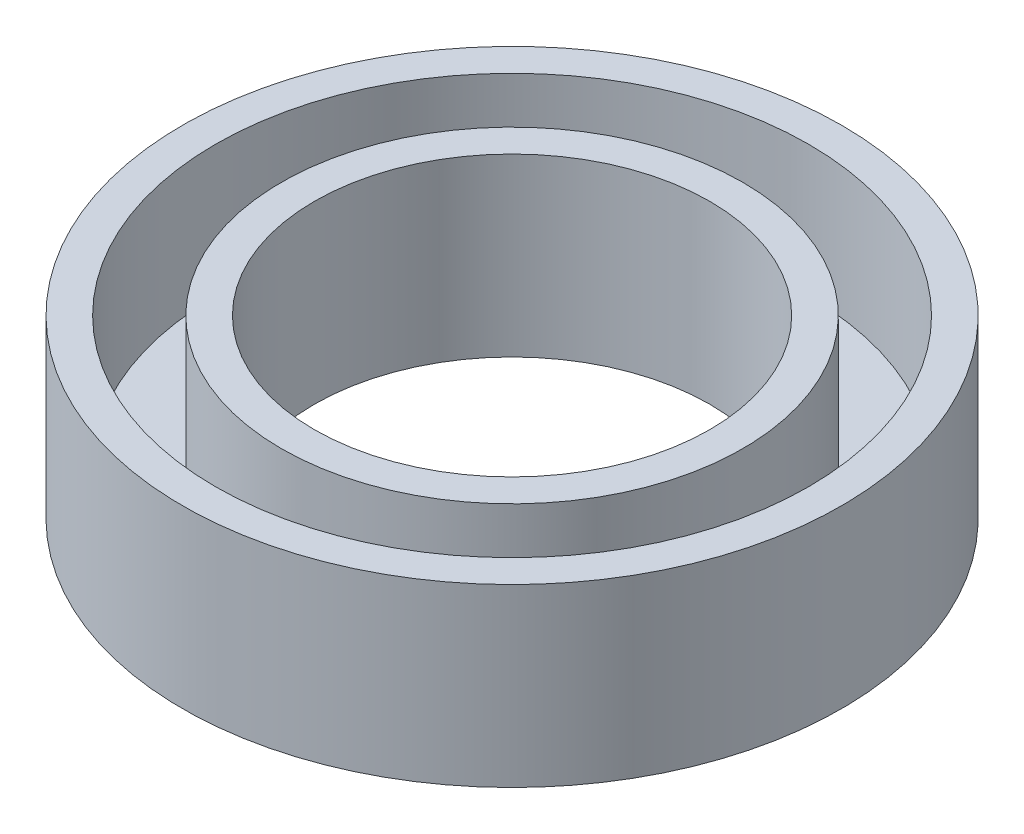
ISO-10303-21;
HEADER;
FILE_DESCRIPTION(('STEP AP214'),'2;1');
FILE_NAME('part.step','',(''),(''),'','','');
FILE_SCHEMA(('AUTOMOTIVE_DESIGN { 1 0 10303 214 1 1 1 1 }'));
ENDSEC;
DATA;
#1=APPLICATION_CONTEXT('core data for automotive mechanical design processes');
#2=APPLICATION_PROTOCOL_DEFINITION('international standard','automotive_design',2000,#1);
#3=PRODUCT_CONTEXT('',#1,'mechanical');
#4=PRODUCT('Part','Part','',(#3));
#5=PRODUCT_RELATED_PRODUCT_CATEGORY('part','',(#4));
#6=PRODUCT_DEFINITION_FORMATION('','',#4);
#7=PRODUCT_DEFINITION_CONTEXT('part definition',#1,'design');
#8=PRODUCT_DEFINITION('design','',#6,#7);
#9=PRODUCT_DEFINITION_SHAPE('','',#8);
#10=(LENGTH_UNIT() NAMED_UNIT(*) SI_UNIT(.MILLI.,.METRE.));
#11=(NAMED_UNIT(*) PLANE_ANGLE_UNIT() SI_UNIT($,.RADIAN.));
#12=(NAMED_UNIT(*) SI_UNIT($,.STERADIAN.) SOLID_ANGLE_UNIT());
#13=UNCERTAINTY_MEASURE_WITH_UNIT(LENGTH_MEASURE(1.E-05),#10,'distance_accuracy_value','');
#14=(GEOMETRIC_REPRESENTATION_CONTEXT(3) GLOBAL_UNCERTAINTY_ASSIGNED_CONTEXT((#13)) GLOBAL_UNIT_ASSIGNED_CONTEXT((#10,
#11,#12)) REPRESENTATION_CONTEXT('',''));
#15=CARTESIAN_POINT('',(0.,0.,0.));
#16=DIRECTION('',(0.,0.,1.));
#17=DIRECTION('',(1.,0.,0.));
#18=AXIS2_PLACEMENT_3D('',#15,#16,#17);
#19=CARTESIAN_POINT('',(0.,0.,0.));
#20=DIRECTION('',(0.,1.,0.));
#21=DIRECTION('',(0.,0.,1.));
#22=AXIS2_PLACEMENT_3D('',#19,#20,#21);
#23=PLANE('',#22);
#24=CARTESIAN_POINT('',(0.,0.,0.));
#25=DIRECTION('',(0.,-1.,0.));
#26=DIRECTION('',(0.,0.,-1.));
#27=AXIS2_PLACEMENT_3D('',#24,#25,#26);
#28=CIRCLE('',#27,9.);
#29=CARTESIAN_POINT('',(0.,0.,-9.));
#30=VERTEX_POINT('',#29);
#31=EDGE_CURVE('E10',#30,#30,#28,.T.);
#32=ORIENTED_EDGE('',*,*,#31,.F.);
#33=EDGE_LOOP('',(#32));
#34=FACE_BOUND('',#33,.T.);
#35=CARTESIAN_POINT('',(0.,0.,0.));
#36=DIRECTION('',(0.,-1.,0.));
#37=DIRECTION('',(0.,0.,-1.));
#38=AXIS2_PLACEMENT_3D('',#35,#36,#37);
#39=CIRCLE('',#38,15.);
#40=CARTESIAN_POINT('',(0.,0.,-15.));
#41=VERTEX_POINT('',#40);
#42=EDGE_CURVE('E76',#41,#41,#39,.T.);
#43=ORIENTED_EDGE('',*,*,#42,.T.);
#44=EDGE_LOOP('',(#43));
#45=FACE_BOUND('',#44,.T.);
#46=ADVANCED_FACE('F41',(#34,#45),#23,.F.);
#47=CARTESIAN_POINT('',(0.,0.,0.));
#48=DIRECTION('',(0.,-1.,0.));
#49=DIRECTION('',(0.,0.,-1.));
#50=AXIS2_PLACEMENT_3D('',#47,#48,#49);
#51=CYLINDRICAL_SURFACE('',#50,9.);
#52=CARTESIAN_POINT('',(0.,8.,0.));
#53=DIRECTION('',(0.,-1.,0.));
#54=DIRECTION('',(0.,0.,-1.));
#55=AXIS2_PLACEMENT_3D('',#52,#53,#54);
#56=CIRCLE('',#55,9.);
#57=CARTESIAN_POINT('',(0.,8.,-9.));
#58=VERTEX_POINT('',#57);
#59=EDGE_CURVE('E48',#58,#58,#56,.T.);
#60=ORIENTED_EDGE('',*,*,#59,.F.);
#61=EDGE_LOOP('',(#60));
#62=FACE_BOUND('',#61,.T.);
#63=ORIENTED_EDGE('',*,*,#31,.T.);
#64=EDGE_LOOP('',(#63));
#65=FACE_BOUND('',#64,.T.);
#66=ADVANCED_FACE('F95',(#62,#65),#51,.F.);
#67=CARTESIAN_POINT('',(0.,8.,0.));
#68=DIRECTION('',(0.,1.,0.));
#69=DIRECTION('',(0.,0.,1.));
#70=AXIS2_PLACEMENT_3D('',#67,#68,#69);
#71=PLANE('',#70);
#72=ORIENTED_EDGE('',*,*,#59,.T.);
#73=EDGE_LOOP('',(#72));
#74=FACE_BOUND('',#73,.T.);
#75=CARTESIAN_POINT('',(0.,8.,0.));
#76=DIRECTION('',(0.,-1.,0.));
#77=DIRECTION('',(0.,0.,-1.));
#78=AXIS2_PLACEMENT_3D('',#75,#76,#77);
#79=CIRCLE('',#78,10.5);
#80=CARTESIAN_POINT('',(0.,8.,-10.5));
#81=VERTEX_POINT('',#80);
#82=EDGE_CURVE('E53',#81,#81,#79,.T.);
#83=ORIENTED_EDGE('',*,*,#82,.F.);
#84=EDGE_LOOP('',(#83));
#85=FACE_BOUND('',#84,.T.);
#86=ADVANCED_FACE('F93',(#74,#85),#71,.T.);
#87=CARTESIAN_POINT('',(0.,0.,0.));
#88=DIRECTION('',(0.,-1.,0.));
#89=DIRECTION('',(0.,0.,-1.));
#90=AXIS2_PLACEMENT_3D('',#87,#88,#89);
#91=CYLINDRICAL_SURFACE('',#90,10.5);
#92=CARTESIAN_POINT('',(0.,2.,0.));
#93=DIRECTION('',(0.,-1.,0.));
#94=DIRECTION('',(0.,0.,-1.));
#95=AXIS2_PLACEMENT_3D('',#92,#93,#94);
#96=CIRCLE('',#95,10.5);
#97=CARTESIAN_POINT('',(0.,2.,-10.5));
#98=VERTEX_POINT('',#97);
#99=EDGE_CURVE('E58',#98,#98,#96,.T.);
#100=ORIENTED_EDGE('',*,*,#99,.F.);
#101=EDGE_LOOP('',(#100));
#102=FACE_BOUND('',#101,.T.);
#103=ORIENTED_EDGE('',*,*,#82,.T.);
#104=EDGE_LOOP('',(#103));
#105=FACE_BOUND('',#104,.T.);
#106=ADVANCED_FACE('F104',(#102,#105),#91,.T.);
#107=CARTESIAN_POINT('',(0.,2.,0.));
#108=DIRECTION('',(0.,1.,0.));
#109=DIRECTION('',(0.,0.,1.));
#110=AXIS2_PLACEMENT_3D('',#107,#108,#109);
#111=PLANE('',#110);
#112=ORIENTED_EDGE('',*,*,#99,.T.);
#113=EDGE_LOOP('',(#112));
#114=FACE_BOUND('',#113,.T.);
#115=CARTESIAN_POINT('',(0.,2.,0.));
#116=DIRECTION('',(0.,-1.,0.));
#117=DIRECTION('',(0.,0.,-1.));
#118=AXIS2_PLACEMENT_3D('',#115,#116,#117);
#119=CIRCLE('',#118,13.5);
#120=CARTESIAN_POINT('',(0.,2.,-13.5));
#121=VERTEX_POINT('',#120);
#122=EDGE_CURVE('E64',#121,#121,#119,.T.);
#123=ORIENTED_EDGE('',*,*,#122,.F.);
#124=EDGE_LOOP('',(#123));
#125=FACE_BOUND('',#124,.T.);
#126=ADVANCED_FACE('F108',(#114,#125),#111,.T.);
#127=CARTESIAN_POINT('',(0.,0.,0.));
#128=DIRECTION('',(0.,-1.,0.));
#129=DIRECTION('',(0.,0.,-1.));
#130=AXIS2_PLACEMENT_3D('',#127,#128,#129);
#131=CYLINDRICAL_SURFACE('',#130,13.5);
#132=ORIENTED_EDGE('',*,*,#122,.T.);
#133=EDGE_LOOP('',(#132));
#134=FACE_BOUND('',#133,.T.);
#135=CARTESIAN_POINT('',(0.,8.,0.));
#136=DIRECTION('',(0.,-1.,0.));
#137=DIRECTION('',(0.,0.,-1.));
#138=AXIS2_PLACEMENT_3D('',#135,#136,#137);
#139=CIRCLE('',#138,13.5);
#140=CARTESIAN_POINT('',(0.,8.,-13.5));
#141=VERTEX_POINT('',#140);
#142=EDGE_CURVE('E68',#141,#141,#139,.T.);
#143=ORIENTED_EDGE('',*,*,#142,.F.);
#144=EDGE_LOOP('',(#143));
#145=FACE_BOUND('',#144,.T.);
#146=ADVANCED_FACE('F90',(#134,#145),#131,.F.);
#147=ORIENTED_EDGE('',*,*,#142,.T.);
#148=EDGE_LOOP('',(#147));
#149=FACE_BOUND('',#148,.T.);
#150=CARTESIAN_POINT('',(0.,8.,0.));
#151=DIRECTION('',(0.,-1.,0.));
#152=DIRECTION('',(0.,0.,-1.));
#153=AXIS2_PLACEMENT_3D('',#150,#151,#152);
#154=CIRCLE('',#153,15.);
#155=CARTESIAN_POINT('',(0.,8.,-15.));
#156=VERTEX_POINT('',#155);
#157=EDGE_CURVE('E72',#156,#156,#154,.T.);
#158=ORIENTED_EDGE('',*,*,#157,.F.);
#159=EDGE_LOOP('',(#158));
#160=FACE_BOUND('',#159,.T.);
#161=ADVANCED_FACE('F84',(#149,#160),#71,.T.);
#162=CARTESIAN_POINT('',(0.,0.,0.));
#163=DIRECTION('',(0.,-1.,0.));
#164=DIRECTION('',(0.,0.,-1.));
#165=AXIS2_PLACEMENT_3D('',#162,#163,#164);
#166=CYLINDRICAL_SURFACE('',#165,15.);
#167=ORIENTED_EDGE('',*,*,#157,.T.);
#168=EDGE_LOOP('',(#167));
#169=FACE_BOUND('',#168,.T.);
#170=ORIENTED_EDGE('',*,*,#42,.F.);
#171=EDGE_LOOP('',(#170));
#172=FACE_BOUND('',#171,.T.);
#173=ADVANCED_FACE('F82',(#169,#172),#166,.T.);
#174=CLOSED_SHELL('',(#46,#66,#86,#106,#126,#146,#161,#173));
#175=MANIFOLD_SOLID_BREP('B2',#174);
#176=ADVANCED_BREP_SHAPE_REPRESENTATION('',(#18,#175),#14);
#177=SHAPE_DEFINITION_REPRESENTATION(#9,#176);
ENDSEC;
END-ISO-10303-21;
